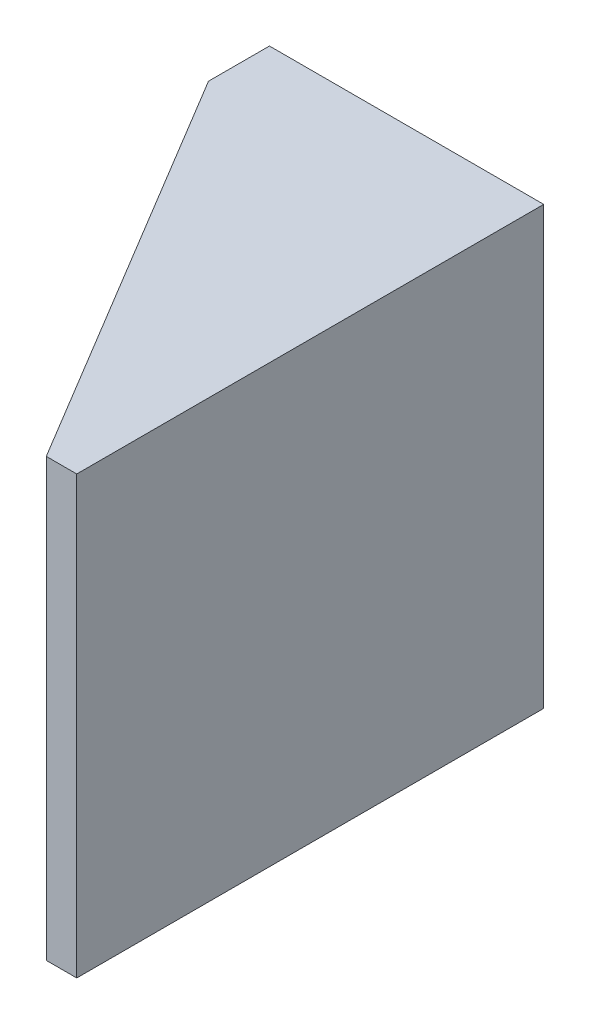
ISO-10303-21;
HEADER;
FILE_DESCRIPTION(('STEP AP214'),'2;1');
FILE_NAME('part.step','',(''),(''),'','','');
FILE_SCHEMA(('AUTOMOTIVE_DESIGN { 1 0 10303 214 1 1 1 1 }'));
ENDSEC;
DATA;
#1=APPLICATION_CONTEXT('core data for automotive mechanical design processes');
#2=APPLICATION_PROTOCOL_DEFINITION('international standard','automotive_design',2000,#1);
#3=PRODUCT_CONTEXT('',#1,'mechanical');
#4=PRODUCT('Part','Part','',(#3));
#5=PRODUCT_RELATED_PRODUCT_CATEGORY('part','',(#4));
#6=PRODUCT_DEFINITION_FORMATION('','',#4);
#7=PRODUCT_DEFINITION_CONTEXT('part definition',#1,'design');
#8=PRODUCT_DEFINITION('design','',#6,#7);
#9=PRODUCT_DEFINITION_SHAPE('','',#8);
#10=(LENGTH_UNIT() NAMED_UNIT(*) SI_UNIT(.MILLI.,.METRE.));
#11=(NAMED_UNIT(*) PLANE_ANGLE_UNIT() SI_UNIT($,.RADIAN.));
#12=(NAMED_UNIT(*) SI_UNIT($,.STERADIAN.) SOLID_ANGLE_UNIT());
#13=UNCERTAINTY_MEASURE_WITH_UNIT(LENGTH_MEASURE(1.E-05),#10,'distance_accuracy_value','');
#14=(GEOMETRIC_REPRESENTATION_CONTEXT(3) GLOBAL_UNCERTAINTY_ASSIGNED_CONTEXT((#13)) GLOBAL_UNIT_ASSIGNED_CONTEXT((#10,
#11,#12)) REPRESENTATION_CONTEXT('',''));
#15=CARTESIAN_POINT('',(0.,0.,0.));
#16=DIRECTION('',(0.,0.,1.));
#17=DIRECTION('',(1.,0.,0.));
#18=AXIS2_PLACEMENT_3D('',#15,#16,#17);
#19=CARTESIAN_POINT('',(-28.575,45.475,0.));
#20=DIRECTION('',(0.,0.,1.));
#21=DIRECTION('',(1.,0.,0.));
#22=AXIS2_PLACEMENT_3D('',#19,#20,#21);
#23=PLANE('',#22);
#24=DIRECTION('',(-1.,0.,0.));
#25=VECTOR('',#24,1.);
#26=CARTESIAN_POINT('',(-28.575,0.,0.));
#27=LINE('',#26,#25);
#28=CARTESIAN_POINT('',(0.,0.,0.));
#29=VERTEX_POINT('',#28);
#30=CARTESIAN_POINT('',(-28.575,0.,0.));
#31=VERTEX_POINT('',#30);
#32=EDGE_CURVE('E143',#29,#31,#27,.T.);
#33=ORIENTED_EDGE('',*,*,#32,.T.);
#34=DIRECTION('',(0.,-1.,0.));
#35=VECTOR('',#34,1.);
#36=CARTESIAN_POINT('',(-28.575,45.475,0.));
#37=LINE('',#36,#35);
#38=CARTESIAN_POINT('',(-28.575,45.475,0.));
#39=VERTEX_POINT('',#38);
#40=EDGE_CURVE('E11',#39,#31,#37,.T.);
#41=ORIENTED_EDGE('',*,*,#40,.F.);
#42=DIRECTION('',(-1.,0.,0.));
#43=VECTOR('',#42,1.);
#44=CARTESIAN_POINT('',(-28.575,45.475,0.));
#45=LINE('',#44,#43);
#46=CARTESIAN_POINT('',(0.,45.475,0.));
#47=VERTEX_POINT('',#46);
#48=EDGE_CURVE('E135',#47,#39,#45,.T.);
#49=ORIENTED_EDGE('',*,*,#48,.F.);
#50=DIRECTION('',(0.,-1.,0.));
#51=VECTOR('',#50,1.);
#52=CARTESIAN_POINT('',(0.,45.475,0.));
#53=LINE('',#52,#51);
#54=EDGE_CURVE('E132',#47,#29,#53,.T.);
#55=ORIENTED_EDGE('',*,*,#54,.T.);
#56=EDGE_LOOP('',(#33,#41,#49,#55));
#57=FACE_BOUND('',#56,.T.);
#58=ADVANCED_FACE('F32',(#57),#23,.F.);
#59=CARTESIAN_POINT('',(-28.575,45.475,6.35));
#60=DIRECTION('',(1.,0.,0.));
#61=DIRECTION('',(0.,0.,-1.));
#62=AXIS2_PLACEMENT_3D('',#59,#60,#61);
#63=PLANE('',#62);
#64=DIRECTION('',(0.,0.,1.));
#65=VECTOR('',#64,1.);
#66=CARTESIAN_POINT('',(-28.575,0.,6.35));
#67=LINE('',#66,#65);
#68=CARTESIAN_POINT('',(-28.575,0.,6.35));
#69=VERTEX_POINT('',#68);
#70=EDGE_CURVE('E122',#31,#69,#67,.T.);
#71=ORIENTED_EDGE('',*,*,#70,.T.);
#72=DIRECTION('',(0.,-1.,0.));
#73=VECTOR('',#72,1.);
#74=CARTESIAN_POINT('',(-28.575,45.475,6.35));
#75=LINE('',#74,#73);
#76=CARTESIAN_POINT('',(-28.575,42.3,6.35));
#77=VERTEX_POINT('',#76);
#78=EDGE_CURVE('E105',#77,#69,#75,.T.);
#79=ORIENTED_EDGE('',*,*,#78,.F.);
#80=CARTESIAN_POINT('',(-28.575,45.475,6.35));
#81=VERTEX_POINT('',#80);
#82=EDGE_CURVE('E40',#81,#77,#75,.T.);
#83=ORIENTED_EDGE('',*,*,#82,.F.);
#84=DIRECTION('',(0.,0.,1.));
#85=VECTOR('',#84,1.);
#86=CARTESIAN_POINT('',(-28.575,45.475,6.35));
#87=LINE('',#86,#85);
#88=EDGE_CURVE('E84',#39,#81,#87,.T.);
#89=ORIENTED_EDGE('',*,*,#88,.F.);
#90=ORIENTED_EDGE('',*,*,#40,.T.);
#91=EDGE_LOOP('',(#71,#79,#83,#89,#90));
#92=FACE_BOUND('',#91,.T.);
#93=ADVANCED_FACE('F121',(#92),#63,.F.);
#94=CARTESIAN_POINT('',(-3.175,45.475,6.35));
#95=DIRECTION('',(0.,0.,-1.));
#96=DIRECTION('',(-1.,0.,0.));
#97=AXIS2_PLACEMENT_3D('',#94,#95,#96);
#98=PLANE('',#97);
#99=DIRECTION('',(0.,-1.,0.));
#100=VECTOR('',#99,1.);
#101=CARTESIAN_POINT('',(-3.175,45.475,6.35));
#102=LINE('',#101,#100);
#103=CARTESIAN_POINT('',(-3.175,42.3,6.35));
#104=VERTEX_POINT('',#103);
#105=CARTESIAN_POINT('',(-3.175,0.,6.35));
#106=VERTEX_POINT('',#105);
#107=EDGE_CURVE('E119',#104,#106,#102,.T.);
#108=ORIENTED_EDGE('',*,*,#107,.F.);
#109=DIRECTION('',(-1.,0.,0.));
#110=VECTOR('',#109,1.);
#111=CARTESIAN_POINT('',(-28.575,42.3,6.35));
#112=LINE('',#111,#110);
#113=EDGE_CURVE('E109',#104,#77,#112,.T.);
#114=ORIENTED_EDGE('',*,*,#113,.T.);
#115=ORIENTED_EDGE('',*,*,#78,.T.);
#116=DIRECTION('',(1.,0.,0.));
#117=VECTOR('',#116,1.);
#118=CARTESIAN_POINT('',(-3.175,0.,6.35));
#119=LINE('',#118,#117);
#120=EDGE_CURVE('E140',#69,#106,#119,.T.);
#121=ORIENTED_EDGE('',*,*,#120,.T.);
#122=EDGE_LOOP('',(#108,#114,#115,#121));
#123=FACE_BOUND('',#122,.T.);
#124=ADVANCED_FACE('F116',(#123),#98,.F.);
#125=CARTESIAN_POINT('',(-3.17499999999999,45.475,48.65));
#126=DIRECTION('',(1.,0.,0.));
#127=DIRECTION('',(0.,0.,-1.));
#128=AXIS2_PLACEMENT_3D('',#125,#126,#127);
#129=PLANE('',#128);
#130=DIRECTION('',(0.,-1.,0.));
#131=VECTOR('',#130,1.);
#132=CARTESIAN_POINT('',(-3.17499999999999,45.475,48.65));
#133=LINE('',#132,#131);
#134=CARTESIAN_POINT('',(-3.17499999999999,42.3,48.65));
#135=VERTEX_POINT('',#134);
#136=CARTESIAN_POINT('',(-3.17499999999999,0.,48.65));
#137=VERTEX_POINT('',#136);
#138=EDGE_CURVE('E129',#135,#137,#133,.T.);
#139=ORIENTED_EDGE('',*,*,#138,.F.);
#140=DIRECTION('',(0.,0.,-1.));
#141=VECTOR('',#140,1.);
#142=CARTESIAN_POINT('',(-3.175,42.3,6.35));
#143=LINE('',#142,#141);
#144=EDGE_CURVE('E111',#135,#104,#143,.T.);
#145=ORIENTED_EDGE('',*,*,#144,.T.);
#146=ORIENTED_EDGE('',*,*,#107,.T.);
#147=DIRECTION('',(0.,0.,1.));
#148=VECTOR('',#147,1.);
#149=CARTESIAN_POINT('',(-3.17499999999999,0.,48.65));
#150=LINE('',#149,#148);
#151=EDGE_CURVE('E137',#106,#137,#150,.T.);
#152=ORIENTED_EDGE('',*,*,#151,.T.);
#153=EDGE_LOOP('',(#139,#145,#146,#152));
#154=FACE_BOUND('',#153,.T.);
#155=ADVANCED_FACE('F153',(#154),#129,.F.);
#156=CARTESIAN_POINT('',(0.,45.475,48.65));
#157=DIRECTION('',(0.,0.,-1.));
#158=DIRECTION('',(-1.,0.,0.));
#159=AXIS2_PLACEMENT_3D('',#156,#157,#158);
#160=PLANE('',#159);
#161=DIRECTION('',(1.,0.,0.));
#162=VECTOR('',#161,1.);
#163=CARTESIAN_POINT('',(0.,0.,48.65));
#164=LINE('',#163,#162);
#165=CARTESIAN_POINT('',(0.,0.,48.65));
#166=VERTEX_POINT('',#165);
#167=EDGE_CURVE('E71',#137,#166,#164,.T.);
#168=ORIENTED_EDGE('',*,*,#167,.T.);
#169=DIRECTION('',(0.,-1.,0.));
#170=VECTOR('',#169,1.);
#171=CARTESIAN_POINT('',(0.,45.475,48.65));
#172=LINE('',#171,#170);
#173=CARTESIAN_POINT('',(0.,45.475,48.65));
#174=VERTEX_POINT('',#173);
#175=EDGE_CURVE('E130',#174,#166,#172,.T.);
#176=ORIENTED_EDGE('',*,*,#175,.F.);
#177=DIRECTION('',(1.,0.,0.));
#178=VECTOR('',#177,1.);
#179=CARTESIAN_POINT('',(0.,45.475,48.65));
#180=LINE('',#179,#178);
#181=CARTESIAN_POINT('',(-3.17499999999999,45.475,48.65));
#182=VERTEX_POINT('',#181);
#183=EDGE_CURVE('E147',#182,#174,#180,.T.);
#184=ORIENTED_EDGE('',*,*,#183,.F.);
#185=EDGE_CURVE('E124',#182,#135,#133,.T.);
#186=ORIENTED_EDGE('',*,*,#185,.T.);
#187=ORIENTED_EDGE('',*,*,#138,.T.);
#188=EDGE_LOOP('',(#168,#176,#184,#186,#187));
#189=FACE_BOUND('',#188,.T.);
#190=ADVANCED_FACE('F156',(#189),#160,.F.);
#191=CARTESIAN_POINT('',(0.,45.475,0.));
#192=DIRECTION('',(-1.,0.,0.));
#193=DIRECTION('',(0.,0.,1.));
#194=AXIS2_PLACEMENT_3D('',#191,#192,#193);
#195=PLANE('',#194);
#196=DIRECTION('',(0.,0.,-1.));
#197=VECTOR('',#196,1.);
#198=CARTESIAN_POINT('',(0.,0.,0.));
#199=LINE('',#198,#197);
#200=EDGE_CURVE('E77',#166,#29,#199,.T.);
#201=ORIENTED_EDGE('',*,*,#200,.T.);
#202=ORIENTED_EDGE('',*,*,#54,.F.);
#203=DIRECTION('',(0.,0.,-1.));
#204=VECTOR('',#203,1.);
#205=CARTESIAN_POINT('',(0.,45.475,0.));
#206=LINE('',#205,#204);
#207=EDGE_CURVE('E48',#174,#47,#206,.T.);
#208=ORIENTED_EDGE('',*,*,#207,.F.);
#209=ORIENTED_EDGE('',*,*,#175,.T.);
#210=EDGE_LOOP('',(#201,#202,#208,#209));
#211=FACE_BOUND('',#210,.T.);
#212=ADVANCED_FACE('F171',(#211),#195,.F.);
#213=CARTESIAN_POINT('',(0.,45.475,0.));
#214=DIRECTION('',(0.,-1.,0.));
#215=DIRECTION('',(0.,0.,-1.));
#216=AXIS2_PLACEMENT_3D('',#213,#214,#215);
#217=PLANE('',#216);
#218=ORIENTED_EDGE('',*,*,#48,.T.);
#219=ORIENTED_EDGE('',*,*,#88,.T.);
#220=DIRECTION('',(0.514793775399234,0.,0.857314043282975));
#221=VECTOR('',#220,1.);
#222=CARTESIAN_POINT('',(-28.575,45.475,6.35));
#223=LINE('',#222,#221);
#224=EDGE_CURVE('E103',#81,#182,#223,.T.);
#225=ORIENTED_EDGE('',*,*,#224,.T.);
#226=ORIENTED_EDGE('',*,*,#183,.T.);
#227=ORIENTED_EDGE('',*,*,#207,.T.);
#228=EDGE_LOOP('',(#218,#219,#225,#226,#227));
#229=FACE_BOUND('',#228,.T.);
#230=ADVANCED_FACE('F157',(#229),#217,.F.);
#231=CARTESIAN_POINT('',(0.,0.,0.));
#232=DIRECTION('',(0.,-1.,0.));
#233=DIRECTION('',(0.,0.,-1.));
#234=AXIS2_PLACEMENT_3D('',#231,#232,#233);
#235=PLANE('',#234);
#236=ORIENTED_EDGE('',*,*,#32,.F.);
#237=ORIENTED_EDGE('',*,*,#200,.F.);
#238=ORIENTED_EDGE('',*,*,#167,.F.);
#239=ORIENTED_EDGE('',*,*,#151,.F.);
#240=ORIENTED_EDGE('',*,*,#120,.F.);
#241=ORIENTED_EDGE('',*,*,#70,.F.);
#242=EDGE_LOOP('',(#236,#237,#238,#239,#240,#241));
#243=FACE_BOUND('',#242,.T.);
#244=ADVANCED_FACE('F163',(#243),#235,.T.);
#245=CARTESIAN_POINT('',(-28.575,42.3,6.35));
#246=DIRECTION('',(-0.857314043282975,0.,0.514793775399234));
#247=DIRECTION('',(0.514793775399234,0.,0.857314043282975));
#248=AXIS2_PLACEMENT_3D('',#245,#246,#247);
#249=PLANE('',#248);
#250=ORIENTED_EDGE('',*,*,#224,.F.);
#251=ORIENTED_EDGE('',*,*,#82,.T.);
#252=DIRECTION('',(0.514793775399234,0.,0.857314043282975));
#253=VECTOR('',#252,1.);
#254=CARTESIAN_POINT('',(-28.575,42.3,6.35));
#255=LINE('',#254,#253);
#256=EDGE_CURVE('E101',#77,#135,#255,.T.);
#257=ORIENTED_EDGE('',*,*,#256,.T.);
#258=ORIENTED_EDGE('',*,*,#185,.F.);
#259=EDGE_LOOP('',(#250,#251,#257,#258));
#260=FACE_BOUND('',#259,.T.);
#261=ADVANCED_FACE('F99',(#260),#249,.T.);
#262=CARTESIAN_POINT('',(0.,42.3,0.));
#263=DIRECTION('',(0.,-1.,0.));
#264=DIRECTION('',(0.,0.,-1.));
#265=AXIS2_PLACEMENT_3D('',#262,#263,#264);
#266=PLANE('',#265);
#267=ORIENTED_EDGE('',*,*,#113,.F.);
#268=ORIENTED_EDGE('',*,*,#144,.F.);
#269=ORIENTED_EDGE('',*,*,#256,.F.);
#270=EDGE_LOOP('',(#267,#268,#269));
#271=FACE_BOUND('',#270,.T.);
#272=ADVANCED_FACE('F108',(#271),#266,.T.);
#273=CLOSED_SHELL('',(#58,#93,#124,#155,#190,#212,#230,#244,#261,#272));
#274=MANIFOLD_SOLID_BREP('B2',#273);
#275=ADVANCED_BREP_SHAPE_REPRESENTATION('',(#18,#274),#14);
#276=SHAPE_DEFINITION_REPRESENTATION(#9,#275);
ENDSEC;
END-ISO-10303-21;
